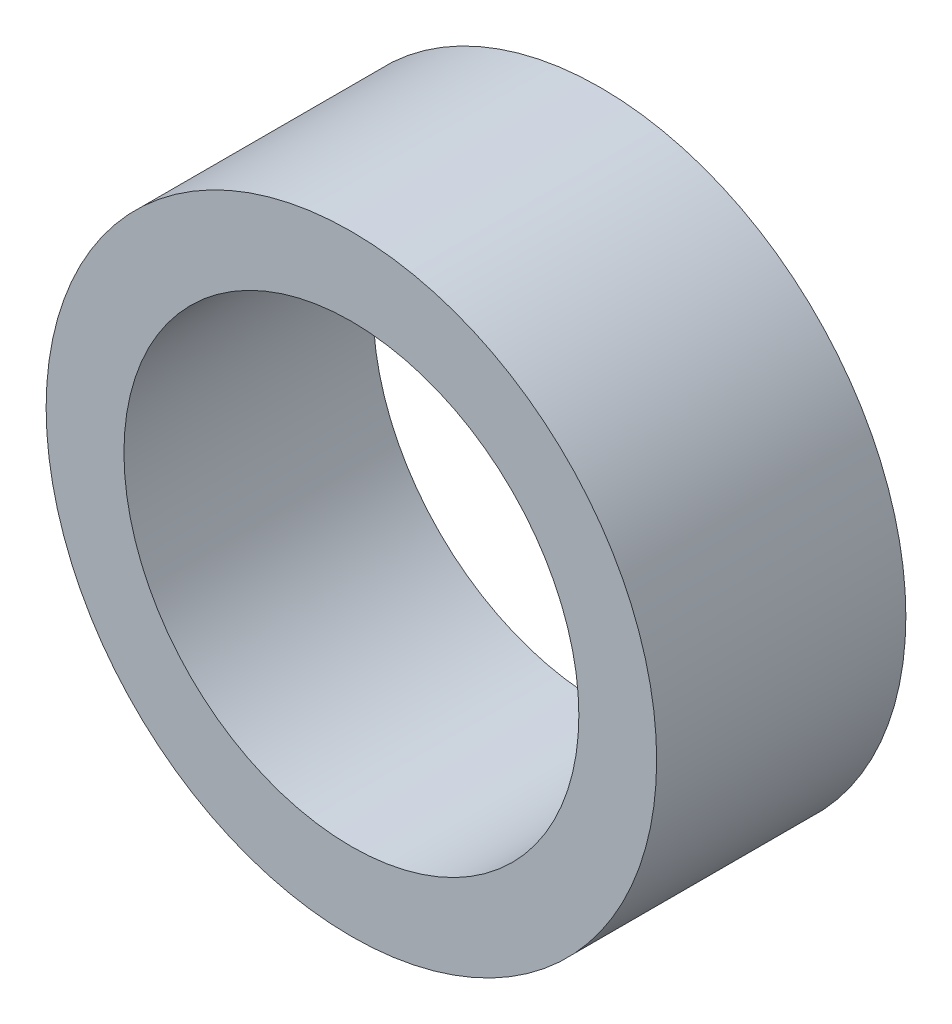
ISO-10303-21;
HEADER;
FILE_DESCRIPTION(('STEP AP214'),'2;1');
FILE_NAME('part.step','',(''),(''),'','','');
FILE_SCHEMA(('AUTOMOTIVE_DESIGN { 1 0 10303 214 1 1 1 1 }'));
ENDSEC;
DATA;
#1=APPLICATION_CONTEXT('core data for automotive mechanical design processes');
#2=APPLICATION_PROTOCOL_DEFINITION('international standard','automotive_design',2000,#1);
#3=PRODUCT_CONTEXT('',#1,'mechanical');
#4=PRODUCT('Part','Part','',(#3));
#5=PRODUCT_RELATED_PRODUCT_CATEGORY('part','',(#4));
#6=PRODUCT_DEFINITION_FORMATION('','',#4);
#7=PRODUCT_DEFINITION_CONTEXT('part definition',#1,'design');
#8=PRODUCT_DEFINITION('design','',#6,#7);
#9=PRODUCT_DEFINITION_SHAPE('','',#8);
#10=(LENGTH_UNIT() NAMED_UNIT(*) SI_UNIT(.MILLI.,.METRE.));
#11=(NAMED_UNIT(*) PLANE_ANGLE_UNIT() SI_UNIT($,.RADIAN.));
#12=(NAMED_UNIT(*) SI_UNIT($,.STERADIAN.) SOLID_ANGLE_UNIT());
#13=UNCERTAINTY_MEASURE_WITH_UNIT(LENGTH_MEASURE(1.E-05),#10,'distance_accuracy_value','');
#14=(GEOMETRIC_REPRESENTATION_CONTEXT(3) GLOBAL_UNCERTAINTY_ASSIGNED_CONTEXT((#13)) GLOBAL_UNIT_ASSIGNED_CONTEXT((#10,
#11,#12)) REPRESENTATION_CONTEXT('',''));
#15=CARTESIAN_POINT('',(0.,0.,0.));
#16=DIRECTION('',(0.,0.,1.));
#17=DIRECTION('',(1.,0.,0.));
#18=AXIS2_PLACEMENT_3D('',#15,#16,#17);
#19=CARTESIAN_POINT('',(0.,0.,20.));
#20=DIRECTION('',(0.,0.,-1.));
#21=DIRECTION('',(-1.,0.,0.));
#22=AXIS2_PLACEMENT_3D('',#19,#20,#21);
#23=CYLINDRICAL_SURFACE('',#22,18.255);
#24=CARTESIAN_POINT('',(0.,0.,20.));
#25=DIRECTION('',(0.,0.,-1.));
#26=DIRECTION('',(1.,0.,0.));
#27=AXIS2_PLACEMENT_3D('',#24,#25,#26);
#28=CIRCLE('',#27,18.255);
#29=CARTESIAN_POINT('',(18.255,0.,20.));
#30=VERTEX_POINT('',#29);
#31=EDGE_CURVE('E9',#30,#30,#28,.T.);
#32=ORIENTED_EDGE('',*,*,#31,.F.);
#33=EDGE_LOOP('',(#32));
#34=FACE_BOUND('',#33,.T.);
#35=CARTESIAN_POINT('',(0.,0.,0.));
#36=DIRECTION('',(0.,0.,-1.));
#37=DIRECTION('',(1.,0.,0.));
#38=AXIS2_PLACEMENT_3D('',#35,#36,#37);
#39=CIRCLE('',#38,18.255);
#40=CARTESIAN_POINT('',(18.255,0.,0.));
#41=VERTEX_POINT('',#40);
#42=EDGE_CURVE('E18',#41,#41,#39,.T.);
#43=ORIENTED_EDGE('',*,*,#42,.T.);
#44=EDGE_LOOP('',(#43));
#45=FACE_BOUND('',#44,.T.);
#46=ADVANCED_FACE('F14',(#34,#45),#23,.F.);
#47=CARTESIAN_POINT('',(0.,0.,20.));
#48=DIRECTION('',(0.,0.,-1.));
#49=DIRECTION('',(-1.,0.,0.));
#50=AXIS2_PLACEMENT_3D('',#47,#48,#49);
#51=CYLINDRICAL_SURFACE('',#50,24.5);
#52=CARTESIAN_POINT('',(0.,0.,20.));
#53=DIRECTION('',(0.,0.,-1.));
#54=DIRECTION('',(1.,0.,0.));
#55=AXIS2_PLACEMENT_3D('',#52,#53,#54);
#56=CIRCLE('',#55,24.5);
#57=CARTESIAN_POINT('',(24.5,0.,20.));
#58=VERTEX_POINT('',#57);
#59=EDGE_CURVE('E22',#58,#58,#56,.T.);
#60=ORIENTED_EDGE('',*,*,#59,.T.);
#61=EDGE_LOOP('',(#60));
#62=FACE_BOUND('',#61,.T.);
#63=CARTESIAN_POINT('',(0.,0.,0.));
#64=DIRECTION('',(0.,0.,-1.));
#65=DIRECTION('',(1.,0.,0.));
#66=AXIS2_PLACEMENT_3D('',#63,#64,#65);
#67=CIRCLE('',#66,24.5);
#68=CARTESIAN_POINT('',(24.5,0.,0.));
#69=VERTEX_POINT('',#68);
#70=EDGE_CURVE('E28',#69,#69,#67,.T.);
#71=ORIENTED_EDGE('',*,*,#70,.F.);
#72=EDGE_LOOP('',(#71));
#73=FACE_BOUND('',#72,.T.);
#74=ADVANCED_FACE('F16',(#62,#73),#51,.T.);
#75=CARTESIAN_POINT('',(0.,0.,20.));
#76=DIRECTION('',(0.,0.,-1.));
#77=DIRECTION('',(-1.,0.,0.));
#78=AXIS2_PLACEMENT_3D('',#75,#76,#77);
#79=PLANE('',#78);
#80=ORIENTED_EDGE('',*,*,#31,.T.);
#81=EDGE_LOOP('',(#80));
#82=FACE_BOUND('',#81,.T.);
#83=ORIENTED_EDGE('',*,*,#59,.F.);
#84=EDGE_LOOP('',(#83));
#85=FACE_BOUND('',#84,.T.);
#86=ADVANCED_FACE('F43',(#82,#85),#79,.F.);
#87=CARTESIAN_POINT('',(0.,0.,0.));
#88=DIRECTION('',(0.,0.,-1.));
#89=DIRECTION('',(-1.,0.,0.));
#90=AXIS2_PLACEMENT_3D('',#87,#88,#89);
#91=PLANE('',#90);
#92=ORIENTED_EDGE('',*,*,#42,.F.);
#93=EDGE_LOOP('',(#92));
#94=FACE_BOUND('',#93,.T.);
#95=ORIENTED_EDGE('',*,*,#70,.T.);
#96=EDGE_LOOP('',(#95));
#97=FACE_BOUND('',#96,.T.);
#98=ADVANCED_FACE('F41',(#94,#97),#91,.T.);
#99=CLOSED_SHELL('',(#46,#74,#86,#98));
#100=MANIFOLD_SOLID_BREP('B1',#99);
#101=ADVANCED_BREP_SHAPE_REPRESENTATION('',(#18,#100),#14);
#102=SHAPE_DEFINITION_REPRESENTATION(#9,#101);
ENDSEC;
END-ISO-10303-21;
